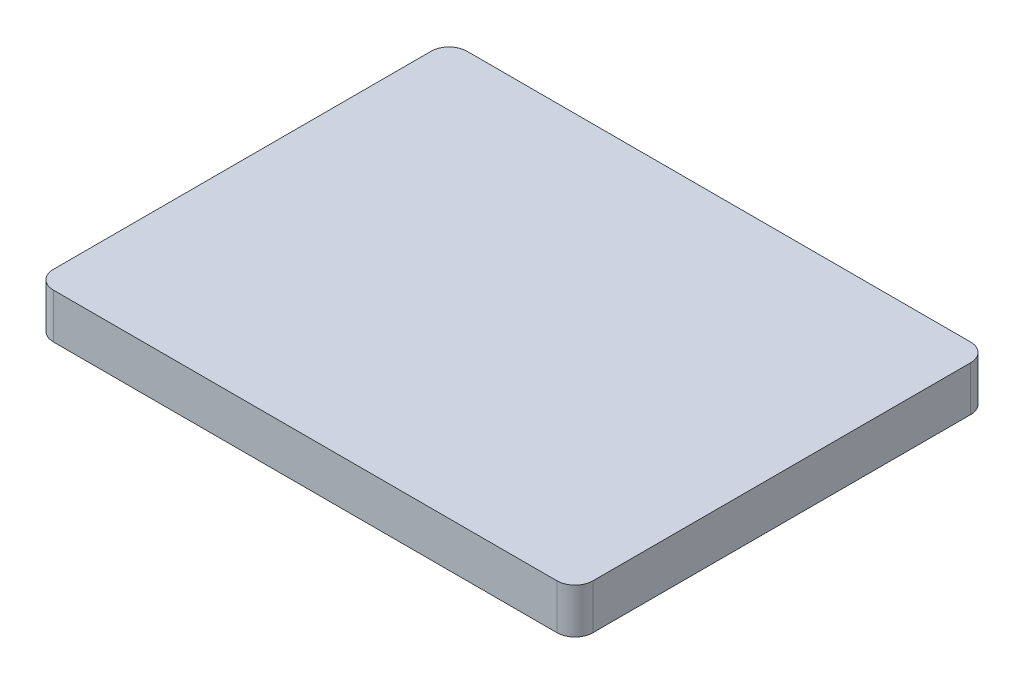
ISO-10303-21;
HEADER;
FILE_DESCRIPTION(('STEP AP214'),'2;1');
FILE_NAME('part.step','',(''),(''),'','','');
FILE_SCHEMA(('AUTOMOTIVE_DESIGN { 1 0 10303 214 1 1 1 1 }'));
ENDSEC;
DATA;
#1=APPLICATION_CONTEXT('core data for automotive mechanical design processes');
#2=APPLICATION_PROTOCOL_DEFINITION('international standard','automotive_design',2000,#1);
#3=PRODUCT_CONTEXT('',#1,'mechanical');
#4=PRODUCT('Part','Part','',(#3));
#5=PRODUCT_RELATED_PRODUCT_CATEGORY('part','',(#4));
#6=PRODUCT_DEFINITION_FORMATION('','',#4);
#7=PRODUCT_DEFINITION_CONTEXT('part definition',#1,'design');
#8=PRODUCT_DEFINITION('design','',#6,#7);
#9=PRODUCT_DEFINITION_SHAPE('','',#8);
#10=(LENGTH_UNIT() NAMED_UNIT(*) SI_UNIT(.MILLI.,.METRE.));
#11=(NAMED_UNIT(*) PLANE_ANGLE_UNIT() SI_UNIT($,.RADIAN.));
#12=(NAMED_UNIT(*) SI_UNIT($,.STERADIAN.) SOLID_ANGLE_UNIT());
#13=UNCERTAINTY_MEASURE_WITH_UNIT(LENGTH_MEASURE(1.E-05),#10,'distance_accuracy_value','');
#14=(GEOMETRIC_REPRESENTATION_CONTEXT(3) GLOBAL_UNCERTAINTY_ASSIGNED_CONTEXT((#13)) GLOBAL_UNIT_ASSIGNED_CONTEXT((#10,
#11,#12)) REPRESENTATION_CONTEXT('',''));
#15=CARTESIAN_POINT('',(0.,0.,0.));
#16=DIRECTION('',(0.,0.,1.));
#17=DIRECTION('',(1.,0.,0.));
#18=AXIS2_PLACEMENT_3D('',#15,#16,#17);
#19=CARTESIAN_POINT('',(-150.,25.,-115.));
#20=DIRECTION('',(1.,0.,0.));
#21=DIRECTION('',(0.,0.,-1.));
#22=AXIS2_PLACEMENT_3D('',#19,#20,#21);
#23=PLANE('',#22);
#24=DIRECTION('',(0.,0.,1.));
#25=VECTOR('',#24,1.);
#26=CARTESIAN_POINT('',(-150.,25.,-115.));
#27=LINE('',#26,#25);
#28=CARTESIAN_POINT('',(-150.,25.,-105.));
#29=VERTEX_POINT('',#28);
#30=CARTESIAN_POINT('',(-150.,25.,105.));
#31=VERTEX_POINT('',#30);
#32=EDGE_CURVE('E125',#29,#31,#27,.T.);
#33=ORIENTED_EDGE('',*,*,#32,.F.);
#34=DIRECTION('',(0.,-1.,0.));
#35=VECTOR('',#34,1.);
#36=CARTESIAN_POINT('',(-150.,25.,-105.));
#37=LINE('',#36,#35);
#38=CARTESIAN_POINT('',(-150.,0.,-105.));
#39=VERTEX_POINT('',#38);
#40=EDGE_CURVE('E109',#29,#39,#37,.T.);
#41=ORIENTED_EDGE('',*,*,#40,.T.);
#42=DIRECTION('',(0.,0.,1.));
#43=VECTOR('',#42,1.);
#44=CARTESIAN_POINT('',(-150.,0.,-115.));
#45=LINE('',#44,#43);
#46=CARTESIAN_POINT('',(-150.,0.,105.));
#47=VERTEX_POINT('',#46);
#48=EDGE_CURVE('E123',#39,#47,#45,.T.);
#49=ORIENTED_EDGE('',*,*,#48,.T.);
#50=DIRECTION('',(0.,-1.,0.));
#51=VECTOR('',#50,1.);
#52=CARTESIAN_POINT('',(-150.,25.,105.));
#53=LINE('',#52,#51);
#54=EDGE_CURVE('E128',#47,#31,#53,.F.);
#55=ORIENTED_EDGE('',*,*,#54,.T.);
#56=EDGE_LOOP('',(#33,#41,#49,#55));
#57=FACE_BOUND('',#56,.T.);
#58=ADVANCED_FACE('F39',(#57),#23,.F.);
#59=CARTESIAN_POINT('',(150.,25.,115.));
#60=DIRECTION('',(0.,0.,-1.));
#61=DIRECTION('',(-1.,0.,0.));
#62=AXIS2_PLACEMENT_3D('',#59,#60,#61);
#63=PLANE('',#62);
#64=DIRECTION('',(1.,0.,0.));
#65=VECTOR('',#64,1.);
#66=CARTESIAN_POINT('',(150.,0.,115.));
#67=LINE('',#66,#65);
#68=CARTESIAN_POINT('',(-140.,0.,115.));
#69=VERTEX_POINT('',#68);
#70=CARTESIAN_POINT('',(140.,0.,115.));
#71=VERTEX_POINT('',#70);
#72=EDGE_CURVE('E127',#69,#71,#67,.T.);
#73=ORIENTED_EDGE('',*,*,#72,.T.);
#74=DIRECTION('',(0.,-1.,0.));
#75=VECTOR('',#74,1.);
#76=CARTESIAN_POINT('',(140.,25.,115.));
#77=LINE('',#76,#75);
#78=CARTESIAN_POINT('',(140.,25.,115.));
#79=VERTEX_POINT('',#78);
#80=EDGE_CURVE('E11',#71,#79,#77,.F.);
#81=ORIENTED_EDGE('',*,*,#80,.T.);
#82=DIRECTION('',(1.,0.,0.));
#83=VECTOR('',#82,1.);
#84=CARTESIAN_POINT('',(150.,25.,115.));
#85=LINE('',#84,#83);
#86=CARTESIAN_POINT('',(-140.,25.,115.));
#87=VERTEX_POINT('',#86);
#88=EDGE_CURVE('E168',#87,#79,#85,.T.);
#89=ORIENTED_EDGE('',*,*,#88,.F.);
#90=DIRECTION('',(0.,-1.,0.));
#91=VECTOR('',#90,1.);
#92=CARTESIAN_POINT('',(-140.,25.,115.));
#93=LINE('',#92,#91);
#94=EDGE_CURVE('E50',#87,#69,#93,.T.);
#95=ORIENTED_EDGE('',*,*,#94,.T.);
#96=EDGE_LOOP('',(#73,#81,#89,#95));
#97=FACE_BOUND('',#96,.T.);
#98=ADVANCED_FACE('F164',(#97),#63,.F.);
#99=CARTESIAN_POINT('',(150.,25.,-115.));
#100=DIRECTION('',(-1.,0.,0.));
#101=DIRECTION('',(0.,0.,1.));
#102=AXIS2_PLACEMENT_3D('',#99,#100,#101);
#103=PLANE('',#102);
#104=DIRECTION('',(0.,0.,-1.));
#105=VECTOR('',#104,1.);
#106=CARTESIAN_POINT('',(150.,0.,-115.));
#107=LINE('',#106,#105);
#108=CARTESIAN_POINT('',(150.,0.,105.));
#109=VERTEX_POINT('',#108);
#110=CARTESIAN_POINT('',(150.,0.,-105.));
#111=VERTEX_POINT('',#110);
#112=EDGE_CURVE('E133',#109,#111,#107,.T.);
#113=ORIENTED_EDGE('',*,*,#112,.T.);
#114=DIRECTION('',(0.,-1.,0.));
#115=VECTOR('',#114,1.);
#116=CARTESIAN_POINT('',(150.,25.,-105.));
#117=LINE('',#116,#115);
#118=CARTESIAN_POINT('',(150.,25.,-105.));
#119=VERTEX_POINT('',#118);
#120=EDGE_CURVE('E53',#111,#119,#117,.F.);
#121=ORIENTED_EDGE('',*,*,#120,.T.);
#122=DIRECTION('',(0.,0.,-1.));
#123=VECTOR('',#122,1.);
#124=CARTESIAN_POINT('',(150.,25.,-115.));
#125=LINE('',#124,#123);
#126=CARTESIAN_POINT('',(150.,25.,105.));
#127=VERTEX_POINT('',#126);
#128=EDGE_CURVE('E174',#127,#119,#125,.T.);
#129=ORIENTED_EDGE('',*,*,#128,.F.);
#130=DIRECTION('',(0.,-1.,0.));
#131=VECTOR('',#130,1.);
#132=CARTESIAN_POINT('',(150.,25.,105.));
#133=LINE('',#132,#131);
#134=EDGE_CURVE('E160',#127,#109,#133,.T.);
#135=ORIENTED_EDGE('',*,*,#134,.T.);
#136=EDGE_LOOP('',(#113,#121,#129,#135));
#137=FACE_BOUND('',#136,.T.);
#138=ADVANCED_FACE('F171',(#137),#103,.F.);
#139=CARTESIAN_POINT('',(150.,25.,-115.));
#140=DIRECTION('',(0.,0.,1.));
#141=DIRECTION('',(1.,0.,0.));
#142=AXIS2_PLACEMENT_3D('',#139,#140,#141);
#143=PLANE('',#142);
#144=DIRECTION('',(-1.,0.,0.));
#145=VECTOR('',#144,1.);
#146=CARTESIAN_POINT('',(150.,0.,-115.));
#147=LINE('',#146,#145);
#148=CARTESIAN_POINT('',(140.,0.,-115.));
#149=VERTEX_POINT('',#148);
#150=CARTESIAN_POINT('',(-140.,0.,-115.));
#151=VERTEX_POINT('',#150);
#152=EDGE_CURVE('E139',#149,#151,#147,.T.);
#153=ORIENTED_EDGE('',*,*,#152,.T.);
#154=DIRECTION('',(0.,-1.,0.));
#155=VECTOR('',#154,1.);
#156=CARTESIAN_POINT('',(-140.,25.,-115.));
#157=LINE('',#156,#155);
#158=CARTESIAN_POINT('',(-140.,25.,-115.));
#159=VERTEX_POINT('',#158);
#160=EDGE_CURVE('E106',#151,#159,#157,.F.);
#161=ORIENTED_EDGE('',*,*,#160,.T.);
#162=DIRECTION('',(-1.,0.,0.));
#163=VECTOR('',#162,1.);
#164=CARTESIAN_POINT('',(150.,25.,-115.));
#165=LINE('',#164,#163);
#166=CARTESIAN_POINT('',(140.,25.,-115.));
#167=VERTEX_POINT('',#166);
#168=EDGE_CURVE('E136',#167,#159,#165,.T.);
#169=ORIENTED_EDGE('',*,*,#168,.F.);
#170=DIRECTION('',(0.,-1.,0.));
#171=VECTOR('',#170,1.);
#172=CARTESIAN_POINT('',(140.,25.,-115.));
#173=LINE('',#172,#171);
#174=EDGE_CURVE('E113',#167,#149,#173,.T.);
#175=ORIENTED_EDGE('',*,*,#174,.T.);
#176=EDGE_LOOP('',(#153,#161,#169,#175));
#177=FACE_BOUND('',#176,.T.);
#178=ADVANCED_FACE('F205',(#177),#143,.F.);
#179=CARTESIAN_POINT('',(0.,25.,0.));
#180=DIRECTION('',(0.,-1.,0.));
#181=DIRECTION('',(0.,0.,-1.));
#182=AXIS2_PLACEMENT_3D('',#179,#180,#181);
#183=PLANE('',#182);
#184=ORIENTED_EDGE('',*,*,#168,.T.);
#185=CARTESIAN_POINT('',(-140.,25.,-105.));
#186=DIRECTION('',(0.,-1.,0.));
#187=DIRECTION('',(0.,0.,-1.));
#188=AXIS2_PLACEMENT_3D('',#185,#186,#187);
#189=CIRCLE('',#188,10.);
#190=EDGE_CURVE('E151',#159,#29,#189,.F.);
#191=ORIENTED_EDGE('',*,*,#190,.T.);
#192=ORIENTED_EDGE('',*,*,#32,.T.);
#193=CARTESIAN_POINT('',(-140.,25.,105.));
#194=DIRECTION('',(0.,-1.,0.));
#195=DIRECTION('',(0.,0.,-1.));
#196=AXIS2_PLACEMENT_3D('',#193,#194,#195);
#197=CIRCLE('',#196,10.);
#198=EDGE_CURVE('E148',#31,#87,#197,.F.);
#199=ORIENTED_EDGE('',*,*,#198,.T.);
#200=ORIENTED_EDGE('',*,*,#88,.T.);
#201=CARTESIAN_POINT('',(140.,25.,105.));
#202=DIRECTION('',(0.,-1.,0.));
#203=DIRECTION('',(0.,0.,-1.));
#204=AXIS2_PLACEMENT_3D('',#201,#202,#203);
#205=CIRCLE('',#204,10.);
#206=EDGE_CURVE('E62',#79,#127,#205,.F.);
#207=ORIENTED_EDGE('',*,*,#206,.T.);
#208=ORIENTED_EDGE('',*,*,#128,.T.);
#209=CARTESIAN_POINT('',(140.,25.,-105.));
#210=DIRECTION('',(0.,-1.,0.));
#211=DIRECTION('',(0.,0.,-1.));
#212=AXIS2_PLACEMENT_3D('',#209,#210,#211);
#213=CIRCLE('',#212,10.);
#214=EDGE_CURVE('E153',#119,#167,#213,.F.);
#215=ORIENTED_EDGE('',*,*,#214,.T.);
#216=EDGE_LOOP('',(#184,#191,#192,#199,#200,#207,#208,#215));
#217=FACE_BOUND('',#216,.T.);
#218=ADVANCED_FACE('F177',(#217),#183,.F.);
#219=CARTESIAN_POINT('',(0.,0.,0.));
#220=DIRECTION('',(0.,-1.,0.));
#221=DIRECTION('',(0.,0.,-1.));
#222=AXIS2_PLACEMENT_3D('',#219,#220,#221);
#223=PLANE('',#222);
#224=ORIENTED_EDGE('',*,*,#48,.F.);
#225=CARTESIAN_POINT('',(-140.,0.,-105.));
#226=DIRECTION('',(0.,-1.,0.));
#227=DIRECTION('',(0.,0.,-1.));
#228=AXIS2_PLACEMENT_3D('',#225,#226,#227);
#229=CIRCLE('',#228,10.);
#230=EDGE_CURVE('E103',#39,#151,#229,.T.);
#231=ORIENTED_EDGE('',*,*,#230,.T.);
#232=ORIENTED_EDGE('',*,*,#152,.F.);
#233=CARTESIAN_POINT('',(140.,0.,-105.));
#234=DIRECTION('',(0.,-1.,0.));
#235=DIRECTION('',(0.,0.,-1.));
#236=AXIS2_PLACEMENT_3D('',#233,#234,#235);
#237=CIRCLE('',#236,10.);
#238=EDGE_CURVE('E117',#149,#111,#237,.T.);
#239=ORIENTED_EDGE('',*,*,#238,.T.);
#240=ORIENTED_EDGE('',*,*,#112,.F.);
#241=CARTESIAN_POINT('',(140.,0.,105.));
#242=DIRECTION('',(0.,-1.,0.));
#243=DIRECTION('',(0.,0.,-1.));
#244=AXIS2_PLACEMENT_3D('',#241,#242,#243);
#245=CIRCLE('',#244,10.);
#246=EDGE_CURVE('E143',#109,#71,#245,.T.);
#247=ORIENTED_EDGE('',*,*,#246,.T.);
#248=ORIENTED_EDGE('',*,*,#72,.F.);
#249=CARTESIAN_POINT('',(-140.,0.,105.));
#250=DIRECTION('',(0.,-1.,0.));
#251=DIRECTION('',(0.,0.,-1.));
#252=AXIS2_PLACEMENT_3D('',#249,#250,#251);
#253=CIRCLE('',#252,10.);
#254=EDGE_CURVE('E124',#69,#47,#253,.T.);
#255=ORIENTED_EDGE('',*,*,#254,.T.);
#256=EDGE_LOOP('',(#224,#231,#232,#239,#240,#247,#248,#255));
#257=FACE_BOUND('',#256,.T.);
#258=ADVANCED_FACE('F126',(#257),#223,.T.);
#259=CARTESIAN_POINT('',(-140.,25.,-105.));
#260=DIRECTION('',(0.,-1.,0.));
#261=DIRECTION('',(0.,0.,-1.));
#262=AXIS2_PLACEMENT_3D('',#259,#260,#261);
#263=CYLINDRICAL_SURFACE('',#262,10.);
#264=ORIENTED_EDGE('',*,*,#190,.F.);
#265=ORIENTED_EDGE('',*,*,#160,.F.);
#266=ORIENTED_EDGE('',*,*,#230,.F.);
#267=ORIENTED_EDGE('',*,*,#40,.F.);
#268=EDGE_LOOP('',(#264,#265,#266,#267));
#269=FACE_BOUND('',#268,.T.);
#270=ADVANCED_FACE('F108',(#269),#263,.T.);
#271=CARTESIAN_POINT('',(140.,25.,-105.));
#272=DIRECTION('',(0.,-1.,0.));
#273=DIRECTION('',(0.,0.,-1.));
#274=AXIS2_PLACEMENT_3D('',#271,#272,#273);
#275=CYLINDRICAL_SURFACE('',#274,10.);
#276=ORIENTED_EDGE('',*,*,#214,.F.);
#277=ORIENTED_EDGE('',*,*,#120,.F.);
#278=ORIENTED_EDGE('',*,*,#238,.F.);
#279=ORIENTED_EDGE('',*,*,#174,.F.);
#280=EDGE_LOOP('',(#276,#277,#278,#279));
#281=FACE_BOUND('',#280,.T.);
#282=ADVANCED_FACE('F182',(#281),#275,.T.);
#283=CARTESIAN_POINT('',(140.,25.,105.));
#284=DIRECTION('',(0.,-1.,0.));
#285=DIRECTION('',(0.,0.,-1.));
#286=AXIS2_PLACEMENT_3D('',#283,#284,#285);
#287=CYLINDRICAL_SURFACE('',#286,10.);
#288=ORIENTED_EDGE('',*,*,#206,.F.);
#289=ORIENTED_EDGE('',*,*,#80,.F.);
#290=ORIENTED_EDGE('',*,*,#246,.F.);
#291=ORIENTED_EDGE('',*,*,#134,.F.);
#292=EDGE_LOOP('',(#288,#289,#290,#291));
#293=FACE_BOUND('',#292,.T.);
#294=ADVANCED_FACE('F175',(#293),#287,.T.);
#295=CARTESIAN_POINT('',(-140.,25.,105.));
#296=DIRECTION('',(0.,-1.,0.));
#297=DIRECTION('',(0.,0.,-1.));
#298=AXIS2_PLACEMENT_3D('',#295,#296,#297);
#299=CYLINDRICAL_SURFACE('',#298,10.);
#300=ORIENTED_EDGE('',*,*,#198,.F.);
#301=ORIENTED_EDGE('',*,*,#54,.F.);
#302=ORIENTED_EDGE('',*,*,#254,.F.);
#303=ORIENTED_EDGE('',*,*,#94,.F.);
#304=EDGE_LOOP('',(#300,#301,#302,#303));
#305=FACE_BOUND('',#304,.T.);
#306=ADVANCED_FACE('F41',(#305),#299,.T.);
#307=CLOSED_SHELL('',(#58,#98,#138,#178,#218,#258,#270,#282,#294,#306));
#308=MANIFOLD_SOLID_BREP('B2',#307);
#309=ADVANCED_BREP_SHAPE_REPRESENTATION('',(#18,#308),#14);
#310=SHAPE_DEFINITION_REPRESENTATION(#9,#309);
ENDSEC;
END-ISO-10303-21;
